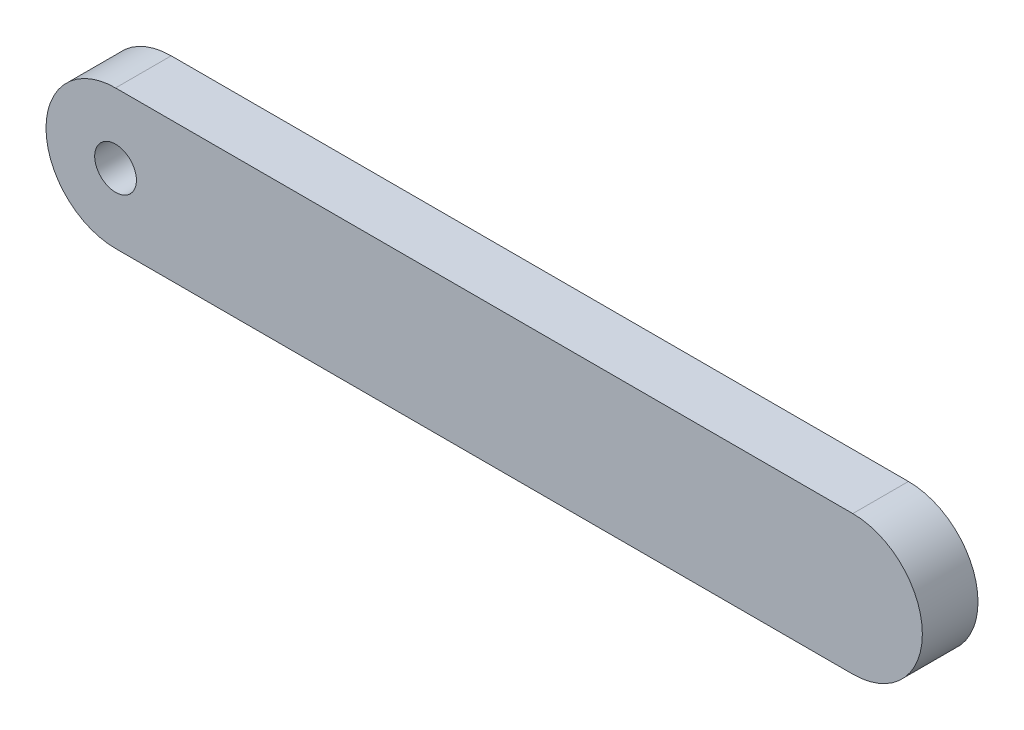
ISO-10303-21;
HEADER;
FILE_DESCRIPTION(('STEP AP214'),'2;1');
FILE_NAME('part.step','',(''),(''),'','','');
FILE_SCHEMA(('AUTOMOTIVE_DESIGN { 1 0 10303 214 1 1 1 1 }'));
ENDSEC;
DATA;
#1=APPLICATION_CONTEXT('core data for automotive mechanical design processes');
#2=APPLICATION_PROTOCOL_DEFINITION('international standard','automotive_design',2000,#1);
#3=PRODUCT_CONTEXT('',#1,'mechanical');
#4=PRODUCT('Part','Part','',(#3));
#5=PRODUCT_RELATED_PRODUCT_CATEGORY('part','',(#4));
#6=PRODUCT_DEFINITION_FORMATION('','',#4);
#7=PRODUCT_DEFINITION_CONTEXT('part definition',#1,'design');
#8=PRODUCT_DEFINITION('design','',#6,#7);
#9=PRODUCT_DEFINITION_SHAPE('','',#8);
#10=(LENGTH_UNIT() NAMED_UNIT(*) SI_UNIT(.MILLI.,.METRE.));
#11=(NAMED_UNIT(*) PLANE_ANGLE_UNIT() SI_UNIT($,.RADIAN.));
#12=(NAMED_UNIT(*) SI_UNIT($,.STERADIAN.) SOLID_ANGLE_UNIT());
#13=UNCERTAINTY_MEASURE_WITH_UNIT(LENGTH_MEASURE(1.E-05),#10,'distance_accuracy_value','');
#14=(GEOMETRIC_REPRESENTATION_CONTEXT(3) GLOBAL_UNCERTAINTY_ASSIGNED_CONTEXT((#13)) GLOBAL_UNIT_ASSIGNED_CONTEXT((#10,
#11,#12)) REPRESENTATION_CONTEXT('',''));
#15=CARTESIAN_POINT('',(0.,0.,0.));
#16=DIRECTION('',(0.,0.,1.));
#17=DIRECTION('',(1.,0.,0.));
#18=AXIS2_PLACEMENT_3D('',#15,#16,#17);
#19=CARTESIAN_POINT('',(0.,0.,4.));
#20=DIRECTION('',(0.,0.,1.));
#21=DIRECTION('',(1.,0.,0.));
#22=AXIS2_PLACEMENT_3D('',#19,#20,#21);
#23=PLANE('',#22);
#24=CARTESIAN_POINT('',(0.,0.,4.));
#25=DIRECTION('',(0.,0.,1.));
#26=DIRECTION('',(1.,0.,0.));
#27=AXIS2_PLACEMENT_3D('',#24,#25,#26);
#28=CIRCLE('',#27,5.);
#29=CARTESIAN_POINT('',(0.,5.,4.));
#30=VERTEX_POINT('',#29);
#31=CARTESIAN_POINT('',(0.,-5.,4.));
#32=VERTEX_POINT('',#31);
#33=EDGE_CURVE('E84',#30,#32,#28,.T.);
#34=ORIENTED_EDGE('',*,*,#33,.T.);
#35=DIRECTION('',(1.,0.,0.));
#36=VECTOR('',#35,1.);
#37=CARTESIAN_POINT('',(0.,-5.,4.));
#38=LINE('',#37,#36);
#39=CARTESIAN_POINT('',(53.,-5.,4.));
#40=VERTEX_POINT('',#39);
#41=EDGE_CURVE('E79',#32,#40,#38,.T.);
#42=ORIENTED_EDGE('',*,*,#41,.T.);
#43=CARTESIAN_POINT('',(53.,0.,4.));
#44=DIRECTION('',(0.,0.,1.));
#45=DIRECTION('',(1.,0.,0.));
#46=AXIS2_PLACEMENT_3D('',#43,#44,#45);
#47=CIRCLE('',#46,5.);
#48=CARTESIAN_POINT('',(53.,5.,4.));
#49=VERTEX_POINT('',#48);
#50=EDGE_CURVE('E82',#40,#49,#47,.T.);
#51=ORIENTED_EDGE('',*,*,#50,.T.);
#52=DIRECTION('',(-1.,0.,0.));
#53=VECTOR('',#52,1.);
#54=CARTESIAN_POINT('',(0.,5.,4.));
#55=LINE('',#54,#53);
#56=EDGE_CURVE('E49',#49,#30,#55,.T.);
#57=ORIENTED_EDGE('',*,*,#56,.T.);
#58=EDGE_LOOP('',(#34,#42,#51,#57));
#59=FACE_BOUND('',#58,.T.);
#60=CARTESIAN_POINT('',(0.,0.,4.));
#61=DIRECTION('',(0.,0.,1.));
#62=DIRECTION('',(1.,0.,0.));
#63=AXIS2_PLACEMENT_3D('',#60,#61,#62);
#64=CIRCLE('',#63,1.5);
#65=CARTESIAN_POINT('',(1.5,0.,4.));
#66=VERTEX_POINT('',#65);
#67=EDGE_CURVE('E99',#66,#66,#64,.T.);
#68=ORIENTED_EDGE('',*,*,#67,.F.);
#69=EDGE_LOOP('',(#68));
#70=FACE_BOUND('',#69,.T.);
#71=ADVANCED_FACE('F32',(#59,#70),#23,.T.);
#72=CARTESIAN_POINT('',(0.,0.,0.));
#73=DIRECTION('',(0.,0.,1.));
#74=DIRECTION('',(1.,0.,0.));
#75=AXIS2_PLACEMENT_3D('',#72,#73,#74);
#76=PLANE('',#75);
#77=CARTESIAN_POINT('',(0.,0.,0.));
#78=DIRECTION('',(0.,0.,1.));
#79=DIRECTION('',(1.,0.,0.));
#80=AXIS2_PLACEMENT_3D('',#77,#78,#79);
#81=CIRCLE('',#80,5.);
#82=CARTESIAN_POINT('',(0.,5.,0.));
#83=VERTEX_POINT('',#82);
#84=CARTESIAN_POINT('',(0.,-5.,0.));
#85=VERTEX_POINT('',#84);
#86=EDGE_CURVE('E96',#83,#85,#81,.T.);
#87=ORIENTED_EDGE('',*,*,#86,.F.);
#88=DIRECTION('',(-1.,0.,0.));
#89=VECTOR('',#88,1.);
#90=CARTESIAN_POINT('',(0.,5.,0.));
#91=LINE('',#90,#89);
#92=CARTESIAN_POINT('',(53.,5.,0.));
#93=VERTEX_POINT('',#92);
#94=EDGE_CURVE('E72',#93,#83,#91,.T.);
#95=ORIENTED_EDGE('',*,*,#94,.F.);
#96=CARTESIAN_POINT('',(53.,0.,0.));
#97=DIRECTION('',(0.,0.,1.));
#98=DIRECTION('',(1.,0.,0.));
#99=AXIS2_PLACEMENT_3D('',#96,#97,#98);
#100=CIRCLE('',#99,5.);
#101=CARTESIAN_POINT('',(53.,-5.,0.));
#102=VERTEX_POINT('',#101);
#103=EDGE_CURVE('E66',#102,#93,#100,.T.);
#104=ORIENTED_EDGE('',*,*,#103,.F.);
#105=DIRECTION('',(1.,0.,0.));
#106=VECTOR('',#105,1.);
#107=CARTESIAN_POINT('',(0.,-5.,0.));
#108=LINE('',#107,#106);
#109=EDGE_CURVE('E88',#85,#102,#108,.T.);
#110=ORIENTED_EDGE('',*,*,#109,.F.);
#111=EDGE_LOOP('',(#87,#95,#104,#110));
#112=FACE_BOUND('',#111,.T.);
#113=CARTESIAN_POINT('',(0.,0.,0.));
#114=DIRECTION('',(0.,0.,1.));
#115=DIRECTION('',(1.,0.,0.));
#116=AXIS2_PLACEMENT_3D('',#113,#114,#115);
#117=CIRCLE('',#116,1.5);
#118=CARTESIAN_POINT('',(1.5,0.,0.));
#119=VERTEX_POINT('',#118);
#120=EDGE_CURVE('E111',#119,#119,#117,.T.);
#121=ORIENTED_EDGE('',*,*,#120,.T.);
#122=EDGE_LOOP('',(#121));
#123=FACE_BOUND('',#122,.T.);
#124=ADVANCED_FACE('F107',(#112,#123),#76,.F.);
#125=CARTESIAN_POINT('',(0.,0.,4.));
#126=DIRECTION('',(0.,0.,-1.));
#127=DIRECTION('',(-1.,0.,0.));
#128=AXIS2_PLACEMENT_3D('',#125,#126,#127);
#129=CYLINDRICAL_SURFACE('',#128,5.);
#130=ORIENTED_EDGE('',*,*,#86,.T.);
#131=DIRECTION('',(0.,0.,-1.));
#132=VECTOR('',#131,1.);
#133=CARTESIAN_POINT('',(0.,-5.,4.));
#134=LINE('',#133,#132);
#135=EDGE_CURVE('E11',#32,#85,#134,.T.);
#136=ORIENTED_EDGE('',*,*,#135,.F.);
#137=ORIENTED_EDGE('',*,*,#33,.F.);
#138=DIRECTION('',(0.,0.,-1.));
#139=VECTOR('',#138,1.);
#140=CARTESIAN_POINT('',(0.,5.,4.));
#141=LINE('',#140,#139);
#142=EDGE_CURVE('E92',#30,#83,#141,.T.);
#143=ORIENTED_EDGE('',*,*,#142,.T.);
#144=EDGE_LOOP('',(#130,#136,#137,#143));
#145=FACE_BOUND('',#144,.T.);
#146=ADVANCED_FACE('F34',(#145),#129,.T.);
#147=CARTESIAN_POINT('',(0.,-5.,4.));
#148=DIRECTION('',(0.,1.,0.));
#149=DIRECTION('',(0.,0.,1.));
#150=AXIS2_PLACEMENT_3D('',#147,#148,#149);
#151=PLANE('',#150);
#152=ORIENTED_EDGE('',*,*,#109,.T.);
#153=DIRECTION('',(0.,0.,-1.));
#154=VECTOR('',#153,1.);
#155=CARTESIAN_POINT('',(53.,-5.,4.));
#156=LINE('',#155,#154);
#157=EDGE_CURVE('E41',#40,#102,#156,.T.);
#158=ORIENTED_EDGE('',*,*,#157,.F.);
#159=ORIENTED_EDGE('',*,*,#41,.F.);
#160=ORIENTED_EDGE('',*,*,#135,.T.);
#161=EDGE_LOOP('',(#152,#158,#159,#160));
#162=FACE_BOUND('',#161,.T.);
#163=ADVANCED_FACE('F87',(#162),#151,.F.);
#164=CARTESIAN_POINT('',(53.,0.,4.));
#165=DIRECTION('',(0.,0.,-1.));
#166=DIRECTION('',(-1.,0.,0.));
#167=AXIS2_PLACEMENT_3D('',#164,#165,#166);
#168=CYLINDRICAL_SURFACE('',#167,5.);
#169=ORIENTED_EDGE('',*,*,#103,.T.);
#170=DIRECTION('',(0.,0.,-1.));
#171=VECTOR('',#170,1.);
#172=CARTESIAN_POINT('',(53.,5.,4.));
#173=LINE('',#172,#171);
#174=EDGE_CURVE('E89',#49,#93,#173,.T.);
#175=ORIENTED_EDGE('',*,*,#174,.F.);
#176=ORIENTED_EDGE('',*,*,#50,.F.);
#177=ORIENTED_EDGE('',*,*,#157,.T.);
#178=EDGE_LOOP('',(#169,#175,#176,#177));
#179=FACE_BOUND('',#178,.T.);
#180=ADVANCED_FACE('F90',(#179),#168,.T.);
#181=CARTESIAN_POINT('',(0.,5.,4.));
#182=DIRECTION('',(0.,-1.,0.));
#183=DIRECTION('',(0.,0.,-1.));
#184=AXIS2_PLACEMENT_3D('',#181,#182,#183);
#185=PLANE('',#184);
#186=ORIENTED_EDGE('',*,*,#94,.T.);
#187=ORIENTED_EDGE('',*,*,#142,.F.);
#188=ORIENTED_EDGE('',*,*,#56,.F.);
#189=ORIENTED_EDGE('',*,*,#174,.T.);
#190=EDGE_LOOP('',(#186,#187,#188,#189));
#191=FACE_BOUND('',#190,.T.);
#192=ADVANCED_FACE('F104',(#191),#185,.F.);
#193=CARTESIAN_POINT('',(0.,0.,4.));
#194=DIRECTION('',(0.,0.,-1.));
#195=DIRECTION('',(-1.,0.,0.));
#196=AXIS2_PLACEMENT_3D('',#193,#194,#195);
#197=CYLINDRICAL_SURFACE('',#196,1.5);
#198=ORIENTED_EDGE('',*,*,#67,.T.);
#199=EDGE_LOOP('',(#198));
#200=FACE_BOUND('',#199,.T.);
#201=ORIENTED_EDGE('',*,*,#120,.F.);
#202=EDGE_LOOP('',(#201));
#203=FACE_BOUND('',#202,.T.);
#204=ADVANCED_FACE('F117',(#200,#203),#197,.F.);
#205=CLOSED_SHELL('',(#71,#124,#146,#163,#180,#192,#204));
#206=MANIFOLD_SOLID_BREP('B2',#205);
#207=ADVANCED_BREP_SHAPE_REPRESENTATION('',(#18,#206),#14);
#208=SHAPE_DEFINITION_REPRESENTATION(#9,#207);
ENDSEC;
END-ISO-10303-21;
